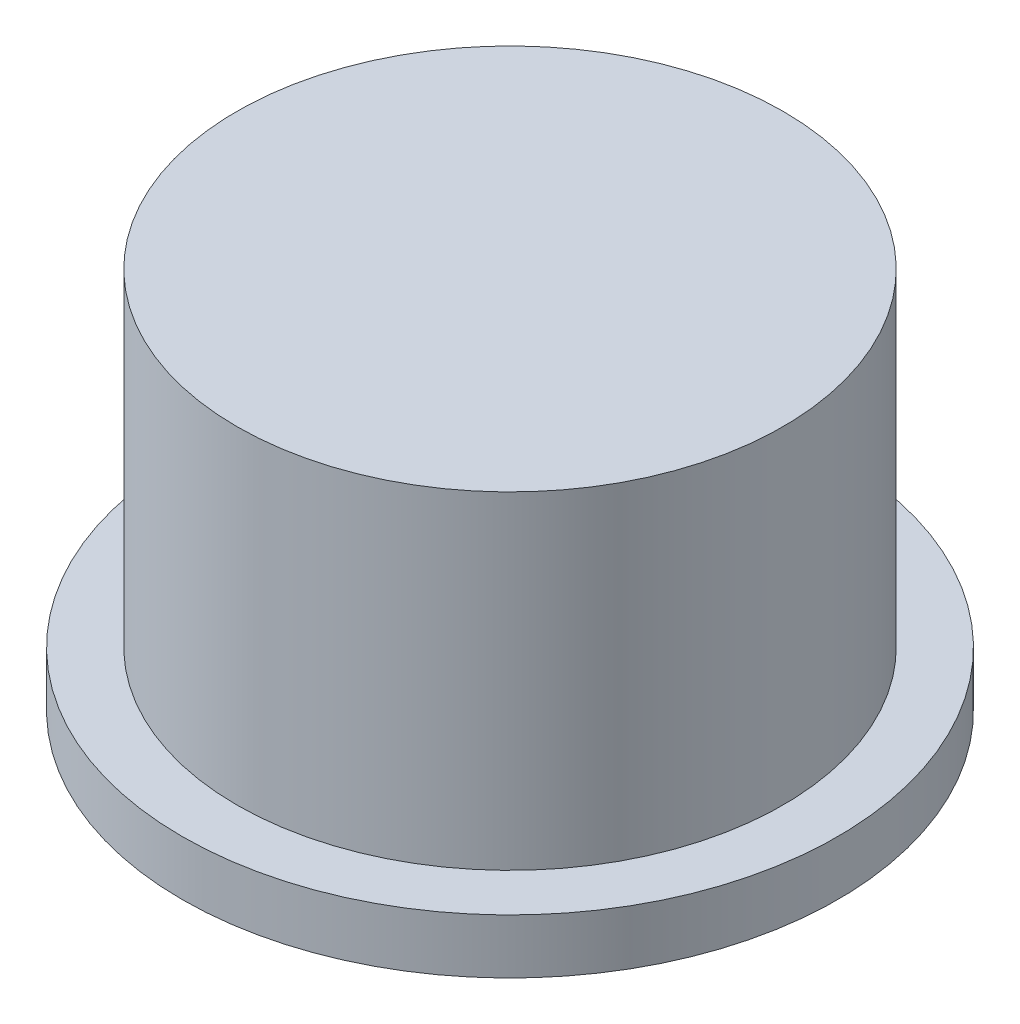
ISO-10303-21;
HEADER;
FILE_DESCRIPTION(('STEP AP214'),'2;1');
FILE_NAME('part.step','',(''),(''),'','','');
FILE_SCHEMA(('AUTOMOTIVE_DESIGN { 1 0 10303 214 1 1 1 1 }'));
ENDSEC;
DATA;
#1=APPLICATION_CONTEXT('core data for automotive mechanical design processes');
#2=APPLICATION_PROTOCOL_DEFINITION('international standard','automotive_design',2000,#1);
#3=PRODUCT_CONTEXT('',#1,'mechanical');
#4=PRODUCT('Part','Part','',(#3));
#5=PRODUCT_RELATED_PRODUCT_CATEGORY('part','',(#4));
#6=PRODUCT_DEFINITION_FORMATION('','',#4);
#7=PRODUCT_DEFINITION_CONTEXT('part definition',#1,'design');
#8=PRODUCT_DEFINITION('design','',#6,#7);
#9=PRODUCT_DEFINITION_SHAPE('','',#8);
#10=(LENGTH_UNIT() NAMED_UNIT(*) SI_UNIT(.MILLI.,.METRE.));
#11=(NAMED_UNIT(*) PLANE_ANGLE_UNIT() SI_UNIT($,.RADIAN.));
#12=(NAMED_UNIT(*) SI_UNIT($,.STERADIAN.) SOLID_ANGLE_UNIT());
#13=UNCERTAINTY_MEASURE_WITH_UNIT(LENGTH_MEASURE(1.E-05),#10,'distance_accuracy_value','');
#14=(GEOMETRIC_REPRESENTATION_CONTEXT(3) GLOBAL_UNCERTAINTY_ASSIGNED_CONTEXT((#13)) GLOBAL_UNIT_ASSIGNED_CONTEXT((#10,
#11,#12)) REPRESENTATION_CONTEXT('',''));
#15=CARTESIAN_POINT('',(0.,0.,0.));
#16=DIRECTION('',(0.,0.,1.));
#17=DIRECTION('',(1.,0.,0.));
#18=AXIS2_PLACEMENT_3D('',#15,#16,#17);
#19=CARTESIAN_POINT('',(0.,7.,0.));
#20=DIRECTION('',(0.,-1.,0.));
#21=DIRECTION('',(0.,0.,-1.));
#22=AXIS2_PLACEMENT_3D('',#19,#20,#21);
#23=CYLINDRICAL_SURFACE('',#22,5.);
#24=CARTESIAN_POINT('',(0.,7.,0.));
#25=DIRECTION('',(0.,1.,0.));
#26=DIRECTION('',(0.,0.,1.));
#27=AXIS2_PLACEMENT_3D('',#24,#25,#26);
#28=CIRCLE('',#27,5.);
#29=CARTESIAN_POINT('',(0.,7.,5.));
#30=VERTEX_POINT('',#29);
#31=EDGE_CURVE('E44',#30,#30,#28,.T.);
#32=ORIENTED_EDGE('',*,*,#31,.F.);
#33=EDGE_LOOP('',(#32));
#34=FACE_BOUND('',#33,.T.);
#35=CARTESIAN_POINT('',(0.,1.,0.));
#36=DIRECTION('',(0.,-1.,0.));
#37=DIRECTION('',(0.,0.,-1.));
#38=AXIS2_PLACEMENT_3D('',#35,#36,#37);
#39=CIRCLE('',#38,5.);
#40=CARTESIAN_POINT('',(0.,1.,-5.));
#41=VERTEX_POINT('',#40);
#42=EDGE_CURVE('E10',#41,#41,#39,.T.);
#43=ORIENTED_EDGE('',*,*,#42,.F.);
#44=EDGE_LOOP('',(#43));
#45=FACE_BOUND('',#44,.T.);
#46=ADVANCED_FACE('F37',(#34,#45),#23,.T.);
#47=CARTESIAN_POINT('',(0.,7.,0.));
#48=DIRECTION('',(0.,1.,0.));
#49=DIRECTION('',(0.,0.,1.));
#50=AXIS2_PLACEMENT_3D('',#47,#48,#49);
#51=PLANE('',#50);
#52=ORIENTED_EDGE('',*,*,#31,.T.);
#53=EDGE_LOOP('',(#52));
#54=FACE_BOUND('',#53,.T.);
#55=ADVANCED_FACE('F66',(#54),#51,.T.);
#56=CARTESIAN_POINT('',(0.,1.,0.));
#57=DIRECTION('',(0.,-1.,0.));
#58=DIRECTION('',(0.,0.,-1.));
#59=AXIS2_PLACEMENT_3D('',#56,#57,#58);
#60=CYLINDRICAL_SURFACE('',#59,6.);
#61=CARTESIAN_POINT('',(0.,1.,0.));
#62=DIRECTION('',(0.,-1.,0.));
#63=DIRECTION('',(0.,0.,-1.));
#64=AXIS2_PLACEMENT_3D('',#61,#62,#63);
#65=CIRCLE('',#64,6.);
#66=CARTESIAN_POINT('',(0.,1.,-6.));
#67=VERTEX_POINT('',#66);
#68=EDGE_CURVE('E49',#67,#67,#65,.T.);
#69=ORIENTED_EDGE('',*,*,#68,.T.);
#70=EDGE_LOOP('',(#69));
#71=FACE_BOUND('',#70,.T.);
#72=CARTESIAN_POINT('',(0.,0.,0.));
#73=DIRECTION('',(0.,-1.,0.));
#74=DIRECTION('',(0.,0.,-1.));
#75=AXIS2_PLACEMENT_3D('',#72,#73,#74);
#76=CIRCLE('',#75,6.);
#77=CARTESIAN_POINT('',(0.,0.,-6.));
#78=VERTEX_POINT('',#77);
#79=EDGE_CURVE('E54',#78,#78,#76,.T.);
#80=ORIENTED_EDGE('',*,*,#79,.F.);
#81=EDGE_LOOP('',(#80));
#82=FACE_BOUND('',#81,.T.);
#83=ADVANCED_FACE('F63',(#71,#82),#60,.T.);
#84=CARTESIAN_POINT('',(0.,1.,0.));
#85=DIRECTION('',(0.,-1.,0.));
#86=DIRECTION('',(0.,0.,-1.));
#87=AXIS2_PLACEMENT_3D('',#84,#85,#86);
#88=PLANE('',#87);
#89=ORIENTED_EDGE('',*,*,#42,.T.);
#90=EDGE_LOOP('',(#89));
#91=FACE_BOUND('',#90,.T.);
#92=ORIENTED_EDGE('',*,*,#68,.F.);
#93=EDGE_LOOP('',(#92));
#94=FACE_BOUND('',#93,.T.);
#95=ADVANCED_FACE('F65',(#91,#94),#88,.F.);
#96=CARTESIAN_POINT('',(0.,0.,0.));
#97=DIRECTION('',(0.,1.,0.));
#98=DIRECTION('',(0.,0.,1.));
#99=AXIS2_PLACEMENT_3D('',#96,#97,#98);
#100=PLANE('',#99);
#101=ORIENTED_EDGE('',*,*,#79,.T.);
#102=EDGE_LOOP('',(#101));
#103=FACE_BOUND('',#102,.T.);
#104=ADVANCED_FACE('F61',(#103),#100,.F.);
#105=CLOSED_SHELL('',(#46,#55,#83,#95,#104));
#106=MANIFOLD_SOLID_BREP('B2',#105);
#107=ADVANCED_BREP_SHAPE_REPRESENTATION('',(#18,#106),#14);
#108=SHAPE_DEFINITION_REPRESENTATION(#9,#107);
ENDSEC;
END-ISO-10303-21;
